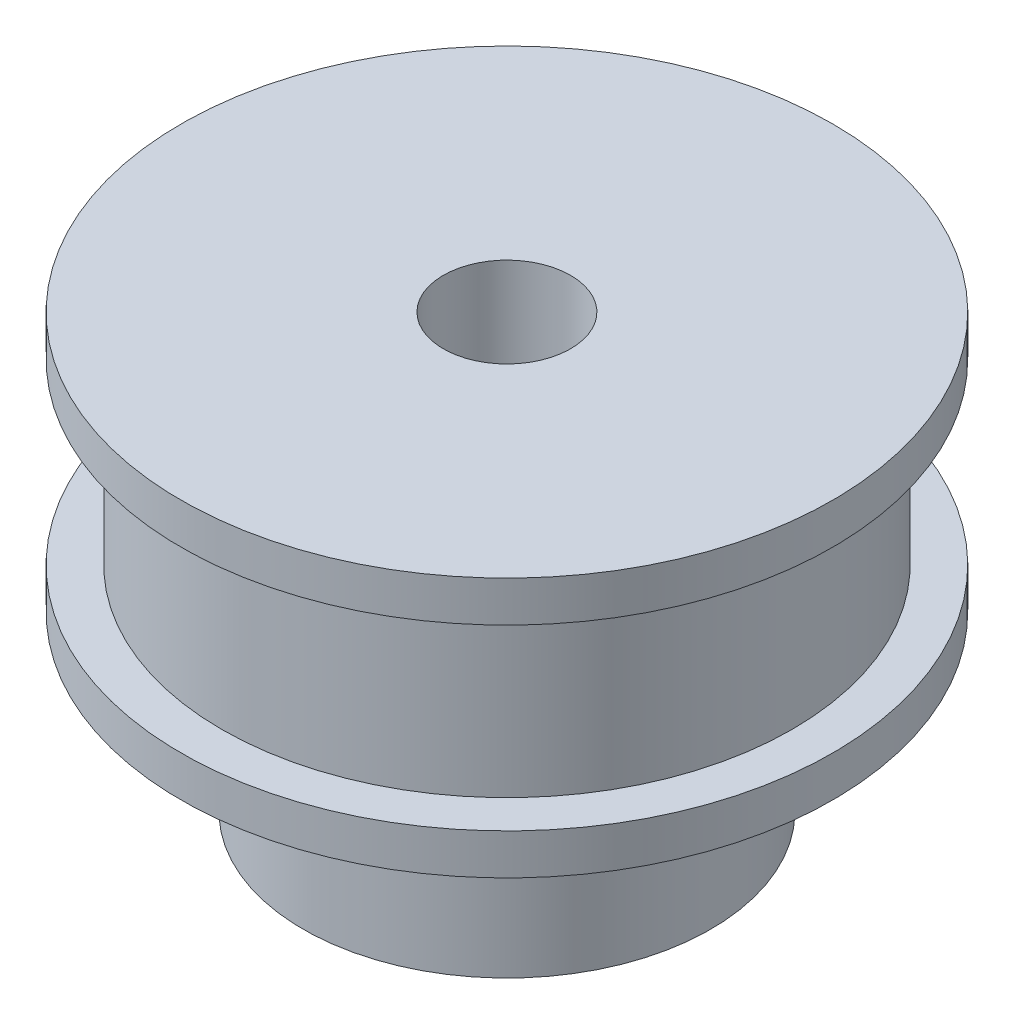
ISO-10303-21;
HEADER;
FILE_DESCRIPTION(('STEP AP214'),'2;1');
FILE_NAME('part.step','',(''),(''),'','','');
FILE_SCHEMA(('AUTOMOTIVE_DESIGN { 1 0 10303 214 1 1 1 1 }'));
ENDSEC;
DATA;
#1=APPLICATION_CONTEXT('core data for automotive mechanical design processes');
#2=APPLICATION_PROTOCOL_DEFINITION('international standard','automotive_design',2000,#1);
#3=PRODUCT_CONTEXT('',#1,'mechanical');
#4=PRODUCT('Part','Part','',(#3));
#5=PRODUCT_RELATED_PRODUCT_CATEGORY('part','',(#4));
#6=PRODUCT_DEFINITION_FORMATION('','',#4);
#7=PRODUCT_DEFINITION_CONTEXT('part definition',#1,'design');
#8=PRODUCT_DEFINITION('design','',#6,#7);
#9=PRODUCT_DEFINITION_SHAPE('','',#8);
#10=(LENGTH_UNIT() NAMED_UNIT(*) SI_UNIT(.MILLI.,.METRE.));
#11=(NAMED_UNIT(*) PLANE_ANGLE_UNIT() SI_UNIT($,.RADIAN.));
#12=(NAMED_UNIT(*) SI_UNIT($,.STERADIAN.) SOLID_ANGLE_UNIT());
#13=UNCERTAINTY_MEASURE_WITH_UNIT(LENGTH_MEASURE(1.E-05),#10,'distance_accuracy_value','');
#14=(GEOMETRIC_REPRESENTATION_CONTEXT(3) GLOBAL_UNCERTAINTY_ASSIGNED_CONTEXT((#13)) GLOBAL_UNIT_ASSIGNED_CONTEXT((#10,
#11,#12)) REPRESENTATION_CONTEXT('',''));
#15=CARTESIAN_POINT('',(0.,0.,0.));
#16=DIRECTION('',(0.,0.,1.));
#17=DIRECTION('',(1.,0.,0.));
#18=AXIS2_PLACEMENT_3D('',#15,#16,#17);
#19=CARTESIAN_POINT('',(8.,0.,0.));
#20=DIRECTION('',(0.,-1.,0.));
#21=DIRECTION('',(0.,0.,-1.));
#22=AXIS2_PLACEMENT_3D('',#19,#20,#21);
#23=PLANE('',#22);
#24=CARTESIAN_POINT('',(0.,0.,0.));
#25=DIRECTION('',(0.,-1.,0.));
#26=DIRECTION('',(0.,0.,-1.));
#27=AXIS2_PLACEMENT_3D('',#24,#25,#26);
#28=CIRCLE('',#27,8.);
#29=CARTESIAN_POINT('',(0.,0.,-8.));
#30=VERTEX_POINT('',#29);
#31=EDGE_CURVE('E10',#30,#30,#28,.T.);
#32=ORIENTED_EDGE('',*,*,#31,.T.);
#33=EDGE_LOOP('',(#32));
#34=FACE_BOUND('',#33,.T.);
#35=CARTESIAN_POINT('',(0.,0.,0.));
#36=DIRECTION('',(0.,-1.,0.));
#37=DIRECTION('',(0.,0.,-1.));
#38=AXIS2_PLACEMENT_3D('',#35,#36,#37);
#39=CIRCLE('',#38,2.5);
#40=CARTESIAN_POINT('',(0.,0.,-2.5));
#41=VERTEX_POINT('',#40);
#42=EDGE_CURVE('E65',#41,#41,#39,.T.);
#43=ORIENTED_EDGE('',*,*,#42,.F.);
#44=EDGE_LOOP('',(#43));
#45=FACE_BOUND('',#44,.T.);
#46=ADVANCED_FACE('F31',(#34,#45),#23,.T.);
#47=CARTESIAN_POINT('',(0.,0.,0.));
#48=DIRECTION('',(0.,-1.,0.));
#49=DIRECTION('',(0.,0.,-1.));
#50=AXIS2_PLACEMENT_3D('',#47,#48,#49);
#51=CYLINDRICAL_SURFACE('',#50,8.);
#52=CARTESIAN_POINT('',(0.,6.8,0.));
#53=DIRECTION('',(0.,-1.,0.));
#54=DIRECTION('',(0.,0.,-1.));
#55=AXIS2_PLACEMENT_3D('',#52,#53,#54);
#56=CIRCLE('',#55,8.);
#57=CARTESIAN_POINT('',(0.,6.8,-8.));
#58=VERTEX_POINT('',#57);
#59=EDGE_CURVE('E37',#58,#58,#56,.T.);
#60=ORIENTED_EDGE('',*,*,#59,.T.);
#61=EDGE_LOOP('',(#60));
#62=FACE_BOUND('',#61,.T.);
#63=ORIENTED_EDGE('',*,*,#31,.F.);
#64=EDGE_LOOP('',(#63));
#65=FACE_BOUND('',#64,.T.);
#66=ADVANCED_FACE('F73',(#62,#65),#51,.T.);
#67=CARTESIAN_POINT('',(8.,6.8,0.));
#68=DIRECTION('',(0.,-1.,0.));
#69=DIRECTION('',(0.,0.,-1.));
#70=AXIS2_PLACEMENT_3D('',#67,#68,#69);
#71=PLANE('',#70);
#72=CARTESIAN_POINT('',(0.,6.8,0.));
#73=DIRECTION('',(0.,-1.,0.));
#74=DIRECTION('',(0.,0.,-1.));
#75=AXIS2_PLACEMENT_3D('',#72,#73,#74);
#76=CIRCLE('',#75,12.8);
#77=CARTESIAN_POINT('',(0.,6.8,-12.8));
#78=VERTEX_POINT('',#77);
#79=EDGE_CURVE('E41',#78,#78,#76,.T.);
#80=ORIENTED_EDGE('',*,*,#79,.T.);
#81=EDGE_LOOP('',(#80));
#82=FACE_BOUND('',#81,.T.);
#83=ORIENTED_EDGE('',*,*,#59,.F.);
#84=EDGE_LOOP('',(#83));
#85=FACE_BOUND('',#84,.T.);
#86=ADVANCED_FACE('F77',(#82,#85),#71,.T.);
#87=CARTESIAN_POINT('',(0.,0.,0.));
#88=DIRECTION('',(0.,-1.,0.));
#89=DIRECTION('',(0.,0.,-1.));
#90=AXIS2_PLACEMENT_3D('',#87,#88,#89);
#91=CYLINDRICAL_SURFACE('',#90,12.8);
#92=CARTESIAN_POINT('',(0.,8.4,0.));
#93=DIRECTION('',(0.,-1.,0.));
#94=DIRECTION('',(0.,0.,-1.));
#95=AXIS2_PLACEMENT_3D('',#92,#93,#94);
#96=CIRCLE('',#95,12.8);
#97=CARTESIAN_POINT('',(0.,8.4,-12.8));
#98=VERTEX_POINT('',#97);
#99=EDGE_CURVE('E45',#98,#98,#96,.T.);
#100=ORIENTED_EDGE('',*,*,#99,.T.);
#101=EDGE_LOOP('',(#100));
#102=FACE_BOUND('',#101,.T.);
#103=ORIENTED_EDGE('',*,*,#79,.F.);
#104=EDGE_LOOP('',(#103));
#105=FACE_BOUND('',#104,.T.);
#106=ADVANCED_FACE('F81',(#102,#105),#91,.T.);
#107=CARTESIAN_POINT('',(12.8,8.4,0.));
#108=DIRECTION('',(0.,1.,0.));
#109=DIRECTION('',(0.,0.,1.));
#110=AXIS2_PLACEMENT_3D('',#107,#108,#109);
#111=PLANE('',#110);
#112=CARTESIAN_POINT('',(0.,8.4,0.));
#113=DIRECTION('',(0.,-1.,0.));
#114=DIRECTION('',(0.,0.,-1.));
#115=AXIS2_PLACEMENT_3D('',#112,#113,#114);
#116=CIRCLE('',#115,11.2);
#117=CARTESIAN_POINT('',(0.,8.4,-11.2));
#118=VERTEX_POINT('',#117);
#119=EDGE_CURVE('E50',#118,#118,#116,.T.);
#120=ORIENTED_EDGE('',*,*,#119,.T.);
#121=EDGE_LOOP('',(#120));
#122=FACE_BOUND('',#121,.T.);
#123=ORIENTED_EDGE('',*,*,#99,.F.);
#124=EDGE_LOOP('',(#123));
#125=FACE_BOUND('',#124,.T.);
#126=ADVANCED_FACE('F88',(#122,#125),#111,.T.);
#127=CARTESIAN_POINT('',(0.,0.,0.));
#128=DIRECTION('',(0.,-1.,0.));
#129=DIRECTION('',(0.,0.,-1.));
#130=AXIS2_PLACEMENT_3D('',#127,#128,#129);
#131=CYLINDRICAL_SURFACE('',#130,11.2);
#132=CARTESIAN_POINT('',(0.,15.4,0.));
#133=DIRECTION('',(0.,-1.,0.));
#134=DIRECTION('',(0.,0.,-1.));
#135=AXIS2_PLACEMENT_3D('',#132,#133,#134);
#136=CIRCLE('',#135,11.2);
#137=CARTESIAN_POINT('',(0.,15.4,-11.2));
#138=VERTEX_POINT('',#137);
#139=EDGE_CURVE('E53',#138,#138,#136,.T.);
#140=ORIENTED_EDGE('',*,*,#139,.T.);
#141=EDGE_LOOP('',(#140));
#142=FACE_BOUND('',#141,.T.);
#143=ORIENTED_EDGE('',*,*,#119,.F.);
#144=EDGE_LOOP('',(#143));
#145=FACE_BOUND('',#144,.T.);
#146=ADVANCED_FACE('F92',(#142,#145),#131,.T.);
#147=CARTESIAN_POINT('',(11.2,15.4,0.));
#148=DIRECTION('',(0.,-1.,0.));
#149=DIRECTION('',(0.,0.,-1.));
#150=AXIS2_PLACEMENT_3D('',#147,#148,#149);
#151=PLANE('',#150);
#152=CARTESIAN_POINT('',(0.,15.4,0.));
#153=DIRECTION('',(0.,-1.,0.));
#154=DIRECTION('',(0.,0.,-1.));
#155=AXIS2_PLACEMENT_3D('',#152,#153,#154);
#156=CIRCLE('',#155,12.8);
#157=CARTESIAN_POINT('',(0.,15.4,-12.8));
#158=VERTEX_POINT('',#157);
#159=EDGE_CURVE('E56',#158,#158,#156,.T.);
#160=ORIENTED_EDGE('',*,*,#159,.T.);
#161=EDGE_LOOP('',(#160));
#162=FACE_BOUND('',#161,.T.);
#163=ORIENTED_EDGE('',*,*,#139,.F.);
#164=EDGE_LOOP('',(#163));
#165=FACE_BOUND('',#164,.T.);
#166=ADVANCED_FACE('F96',(#162,#165),#151,.T.);
#167=CARTESIAN_POINT('',(0.,0.,0.));
#168=DIRECTION('',(0.,-1.,0.));
#169=DIRECTION('',(0.,0.,-1.));
#170=AXIS2_PLACEMENT_3D('',#167,#168,#169);
#171=CYLINDRICAL_SURFACE('',#170,12.8);
#172=CARTESIAN_POINT('',(0.,17.,0.));
#173=DIRECTION('',(0.,-1.,0.));
#174=DIRECTION('',(0.,0.,-1.));
#175=AXIS2_PLACEMENT_3D('',#172,#173,#174);
#176=CIRCLE('',#175,12.8);
#177=CARTESIAN_POINT('',(0.,17.,-12.8));
#178=VERTEX_POINT('',#177);
#179=EDGE_CURVE('E59',#178,#178,#176,.T.);
#180=ORIENTED_EDGE('',*,*,#179,.T.);
#181=EDGE_LOOP('',(#180));
#182=FACE_BOUND('',#181,.T.);
#183=ORIENTED_EDGE('',*,*,#159,.F.);
#184=EDGE_LOOP('',(#183));
#185=FACE_BOUND('',#184,.T.);
#186=ADVANCED_FACE('F100',(#182,#185),#171,.T.);
#187=CARTESIAN_POINT('',(12.8,17.,0.));
#188=DIRECTION('',(0.,1.,0.));
#189=DIRECTION('',(0.,0.,1.));
#190=AXIS2_PLACEMENT_3D('',#187,#188,#189);
#191=PLANE('',#190);
#192=CARTESIAN_POINT('',(0.,17.,0.));
#193=DIRECTION('',(0.,-1.,0.));
#194=DIRECTION('',(0.,0.,-1.));
#195=AXIS2_PLACEMENT_3D('',#192,#193,#194);
#196=CIRCLE('',#195,2.5);
#197=CARTESIAN_POINT('',(0.,17.,-2.5));
#198=VERTEX_POINT('',#197);
#199=EDGE_CURVE('E62',#198,#198,#196,.T.);
#200=ORIENTED_EDGE('',*,*,#199,.T.);
#201=EDGE_LOOP('',(#200));
#202=FACE_BOUND('',#201,.T.);
#203=ORIENTED_EDGE('',*,*,#179,.F.);
#204=EDGE_LOOP('',(#203));
#205=FACE_BOUND('',#204,.T.);
#206=ADVANCED_FACE('F104',(#202,#205),#191,.T.);
#207=CARTESIAN_POINT('',(0.,0.,0.));
#208=DIRECTION('',(0.,-1.,0.));
#209=DIRECTION('',(0.,0.,-1.));
#210=AXIS2_PLACEMENT_3D('',#207,#208,#209);
#211=CYLINDRICAL_SURFACE('',#210,2.5);
#212=ORIENTED_EDGE('',*,*,#42,.T.);
#213=EDGE_LOOP('',(#212));
#214=FACE_BOUND('',#213,.T.);
#215=ORIENTED_EDGE('',*,*,#199,.F.);
#216=EDGE_LOOP('',(#215));
#217=FACE_BOUND('',#216,.T.);
#218=ADVANCED_FACE('F69',(#214,#217),#211,.F.);
#219=CLOSED_SHELL('',(#46,#66,#86,#106,#126,#146,#166,#186,#206,#218));
#220=MANIFOLD_SOLID_BREP('B2',#219);
#221=ADVANCED_BREP_SHAPE_REPRESENTATION('',(#18,#220),#14);
#222=SHAPE_DEFINITION_REPRESENTATION(#9,#221);
ENDSEC;
END-ISO-10303-21;
